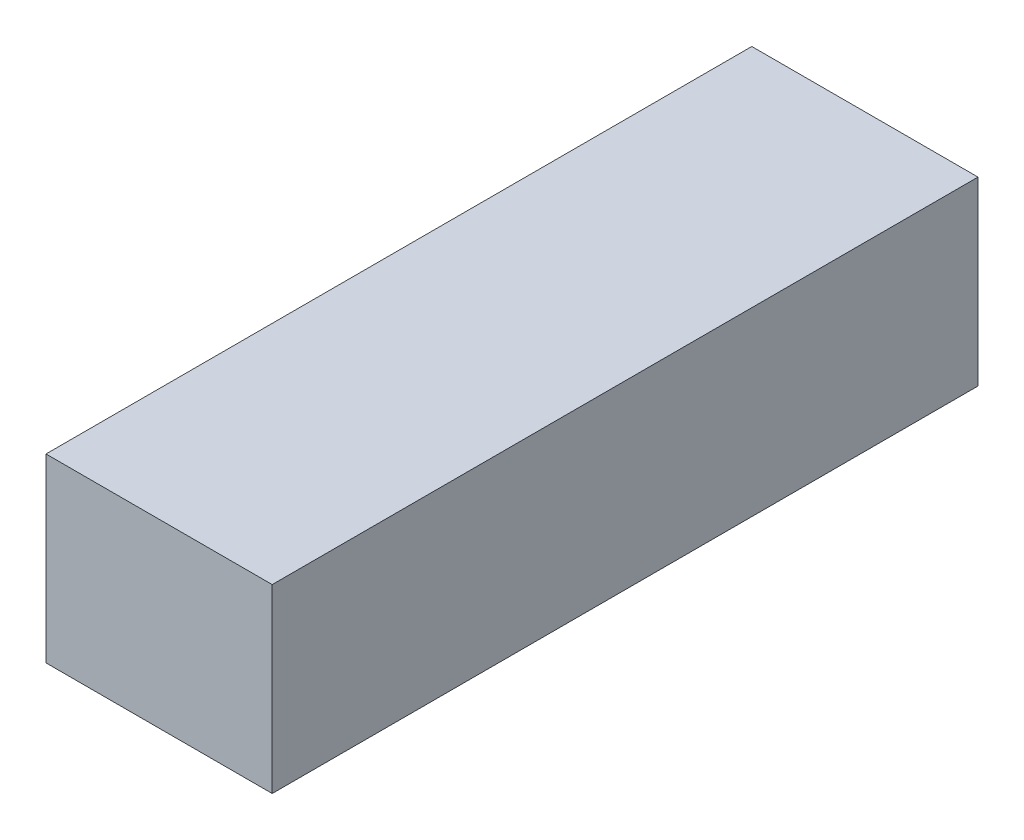
ISO-10303-21;
HEADER;
FILE_DESCRIPTION(('STEP AP214'),'2;1');
FILE_NAME('part.step','',(''),(''),'','','');
FILE_SCHEMA(('AUTOMOTIVE_DESIGN { 1 0 10303 214 1 1 1 1 }'));
ENDSEC;
DATA;
#1=APPLICATION_CONTEXT('core data for automotive mechanical design processes');
#2=APPLICATION_PROTOCOL_DEFINITION('international standard','automotive_design',2000,#1);
#3=PRODUCT_CONTEXT('',#1,'mechanical');
#4=PRODUCT('Part','Part','',(#3));
#5=PRODUCT_RELATED_PRODUCT_CATEGORY('part','',(#4));
#6=PRODUCT_DEFINITION_FORMATION('','',#4);
#7=PRODUCT_DEFINITION_CONTEXT('part definition',#1,'design');
#8=PRODUCT_DEFINITION('design','',#6,#7);
#9=PRODUCT_DEFINITION_SHAPE('','',#8);
#10=(LENGTH_UNIT() NAMED_UNIT(*) SI_UNIT(.MILLI.,.METRE.));
#11=(NAMED_UNIT(*) PLANE_ANGLE_UNIT() SI_UNIT($,.RADIAN.));
#12=(NAMED_UNIT(*) SI_UNIT($,.STERADIAN.) SOLID_ANGLE_UNIT());
#13=UNCERTAINTY_MEASURE_WITH_UNIT(LENGTH_MEASURE(1.E-05),#10,'distance_accuracy_value','');
#14=(GEOMETRIC_REPRESENTATION_CONTEXT(3) GLOBAL_UNCERTAINTY_ASSIGNED_CONTEXT((#13)) GLOBAL_UNIT_ASSIGNED_CONTEXT((#10,
#11,#12)) REPRESENTATION_CONTEXT('',''));
#15=CARTESIAN_POINT('',(0.,0.,0.));
#16=DIRECTION('',(0.,0.,1.));
#17=DIRECTION('',(1.,0.,0.));
#18=AXIS2_PLACEMENT_3D('',#15,#16,#17);
#19=CARTESIAN_POINT('',(0.,0.,78.0000000000001));
#20=DIRECTION('',(1.,0.,0.));
#21=DIRECTION('',(0.,1.,0.));
#22=AXIS2_PLACEMENT_3D('',#19,#20,#21);
#23=PLANE('',#22);
#24=DIRECTION('',(0.,-1.,0.));
#25=VECTOR('',#24,1.);
#26=CARTESIAN_POINT('',(0.,0.,0.));
#27=LINE('',#26,#25);
#28=CARTESIAN_POINT('',(0.,0.,0.));
#29=VERTEX_POINT('',#28);
#30=CARTESIAN_POINT('',(0.,-20.,0.));
#31=VERTEX_POINT('',#30);
#32=EDGE_CURVE('E107',#29,#31,#27,.T.);
#33=ORIENTED_EDGE('',*,*,#32,.T.);
#34=DIRECTION('',(0.,0.,-1.));
#35=VECTOR('',#34,1.);
#36=CARTESIAN_POINT('',(0.,-20.,78.0000000000001));
#37=LINE('',#36,#35);
#38=CARTESIAN_POINT('',(0.,-20.,78.0000000000001));
#39=VERTEX_POINT('',#38);
#40=EDGE_CURVE('E11',#39,#31,#37,.T.);
#41=ORIENTED_EDGE('',*,*,#40,.F.);
#42=DIRECTION('',(0.,-1.,0.));
#43=VECTOR('',#42,1.);
#44=CARTESIAN_POINT('',(0.,0.,78.0000000000001));
#45=LINE('',#44,#43);
#46=CARTESIAN_POINT('',(0.,0.,78.0000000000001));
#47=VERTEX_POINT('',#46);
#48=EDGE_CURVE('E91',#47,#39,#45,.T.);
#49=ORIENTED_EDGE('',*,*,#48,.F.);
#50=DIRECTION('',(0.,0.,-1.));
#51=VECTOR('',#50,1.);
#52=CARTESIAN_POINT('',(0.,0.,78.0000000000001));
#53=LINE('',#52,#51);
#54=EDGE_CURVE('E103',#47,#29,#53,.T.);
#55=ORIENTED_EDGE('',*,*,#54,.T.);
#56=EDGE_LOOP('',(#33,#41,#49,#55));
#57=FACE_BOUND('',#56,.T.);
#58=ADVANCED_FACE('F39',(#57),#23,.F.);
#59=CARTESIAN_POINT('',(0.,-20.,78.0000000000001));
#60=DIRECTION('',(0.,1.,0.));
#61=DIRECTION('',(0.,0.,1.));
#62=AXIS2_PLACEMENT_3D('',#59,#60,#61);
#63=PLANE('',#62);
#64=DIRECTION('',(1.,0.,0.));
#65=VECTOR('',#64,1.);
#66=CARTESIAN_POINT('',(0.,-20.,0.));
#67=LINE('',#66,#65);
#68=CARTESIAN_POINT('',(25.,-20.,0.));
#69=VERTEX_POINT('',#68);
#70=EDGE_CURVE('E96',#31,#69,#67,.T.);
#71=ORIENTED_EDGE('',*,*,#70,.T.);
#72=DIRECTION('',(0.,0.,-1.));
#73=VECTOR('',#72,1.);
#74=CARTESIAN_POINT('',(25.,-20.,78.0000000000001));
#75=LINE('',#74,#73);
#76=CARTESIAN_POINT('',(25.,-20.,78.0000000000001));
#77=VERTEX_POINT('',#76);
#78=EDGE_CURVE('E48',#77,#69,#75,.T.);
#79=ORIENTED_EDGE('',*,*,#78,.F.);
#80=DIRECTION('',(1.,0.,0.));
#81=VECTOR('',#80,1.);
#82=CARTESIAN_POINT('',(0.,-20.,78.0000000000001));
#83=LINE('',#82,#81);
#84=EDGE_CURVE('E86',#39,#77,#83,.T.);
#85=ORIENTED_EDGE('',*,*,#84,.F.);
#86=ORIENTED_EDGE('',*,*,#40,.T.);
#87=EDGE_LOOP('',(#71,#79,#85,#86));
#88=FACE_BOUND('',#87,.T.);
#89=ADVANCED_FACE('F95',(#88),#63,.F.);
#90=CARTESIAN_POINT('',(25.,0.,78.0000000000001));
#91=DIRECTION('',(-1.,0.,0.));
#92=DIRECTION('',(0.,0.,1.));
#93=AXIS2_PLACEMENT_3D('',#90,#91,#92);
#94=PLANE('',#93);
#95=DIRECTION('',(0.,1.,0.));
#96=VECTOR('',#95,1.);
#97=CARTESIAN_POINT('',(25.,0.,0.));
#98=LINE('',#97,#96);
#99=CARTESIAN_POINT('',(25.,0.,0.));
#100=VERTEX_POINT('',#99);
#101=EDGE_CURVE('E73',#69,#100,#98,.T.);
#102=ORIENTED_EDGE('',*,*,#101,.T.);
#103=DIRECTION('',(0.,0.,-1.));
#104=VECTOR('',#103,1.);
#105=CARTESIAN_POINT('',(25.,0.,78.0000000000001));
#106=LINE('',#105,#104);
#107=CARTESIAN_POINT('',(25.,0.,78.0000000000001));
#108=VERTEX_POINT('',#107);
#109=EDGE_CURVE('E98',#108,#100,#106,.T.);
#110=ORIENTED_EDGE('',*,*,#109,.F.);
#111=DIRECTION('',(0.,1.,0.));
#112=VECTOR('',#111,1.);
#113=CARTESIAN_POINT('',(25.,0.,78.0000000000001));
#114=LINE('',#113,#112);
#115=EDGE_CURVE('E89',#77,#108,#114,.T.);
#116=ORIENTED_EDGE('',*,*,#115,.F.);
#117=ORIENTED_EDGE('',*,*,#78,.T.);
#118=EDGE_LOOP('',(#102,#110,#116,#117));
#119=FACE_BOUND('',#118,.T.);
#120=ADVANCED_FACE('F99',(#119),#94,.F.);
#121=CARTESIAN_POINT('',(0.,0.,78.0000000000001));
#122=DIRECTION('',(0.,-1.,0.));
#123=DIRECTION('',(0.,0.,-1.));
#124=AXIS2_PLACEMENT_3D('',#121,#122,#123);
#125=PLANE('',#124);
#126=DIRECTION('',(-1.,0.,0.));
#127=VECTOR('',#126,1.);
#128=CARTESIAN_POINT('',(0.,0.,0.));
#129=LINE('',#128,#127);
#130=EDGE_CURVE('E79',#100,#29,#129,.T.);
#131=ORIENTED_EDGE('',*,*,#130,.T.);
#132=ORIENTED_EDGE('',*,*,#54,.F.);
#133=DIRECTION('',(-1.,0.,0.));
#134=VECTOR('',#133,1.);
#135=CARTESIAN_POINT('',(0.,0.,78.0000000000001));
#136=LINE('',#135,#134);
#137=EDGE_CURVE('E56',#108,#47,#136,.T.);
#138=ORIENTED_EDGE('',*,*,#137,.F.);
#139=ORIENTED_EDGE('',*,*,#109,.T.);
#140=EDGE_LOOP('',(#131,#132,#138,#139));
#141=FACE_BOUND('',#140,.T.);
#142=ADVANCED_FACE('F120',(#141),#125,.F.);
#143=CARTESIAN_POINT('',(0.,0.,78.0000000000001));
#144=DIRECTION('',(0.,0.,1.));
#145=DIRECTION('',(1.,0.,0.));
#146=AXIS2_PLACEMENT_3D('',#143,#144,#145);
#147=PLANE('',#146);
#148=ORIENTED_EDGE('',*,*,#48,.T.);
#149=ORIENTED_EDGE('',*,*,#84,.T.);
#150=ORIENTED_EDGE('',*,*,#115,.T.);
#151=ORIENTED_EDGE('',*,*,#137,.T.);
#152=EDGE_LOOP('',(#148,#149,#150,#151));
#153=FACE_BOUND('',#152,.T.);
#154=ADVANCED_FACE('F87',(#153),#147,.T.);
#155=CARTESIAN_POINT('',(0.,0.,0.));
#156=DIRECTION('',(0.,0.,1.));
#157=DIRECTION('',(1.,0.,0.));
#158=AXIS2_PLACEMENT_3D('',#155,#156,#157);
#159=PLANE('',#158);
#160=ORIENTED_EDGE('',*,*,#32,.F.);
#161=ORIENTED_EDGE('',*,*,#130,.F.);
#162=ORIENTED_EDGE('',*,*,#101,.F.);
#163=ORIENTED_EDGE('',*,*,#70,.F.);
#164=EDGE_LOOP('',(#160,#161,#162,#163));
#165=FACE_BOUND('',#164,.T.);
#166=ADVANCED_FACE('F123',(#165),#159,.F.);
#167=CLOSED_SHELL('',(#58,#89,#120,#142,#154,#166));
#168=MANIFOLD_SOLID_BREP('B2',#167);
#169=ADVANCED_BREP_SHAPE_REPRESENTATION('',(#18,#168),#14);
#170=SHAPE_DEFINITION_REPRESENTATION(#9,#169);
ENDSEC;
END-ISO-10303-21;
